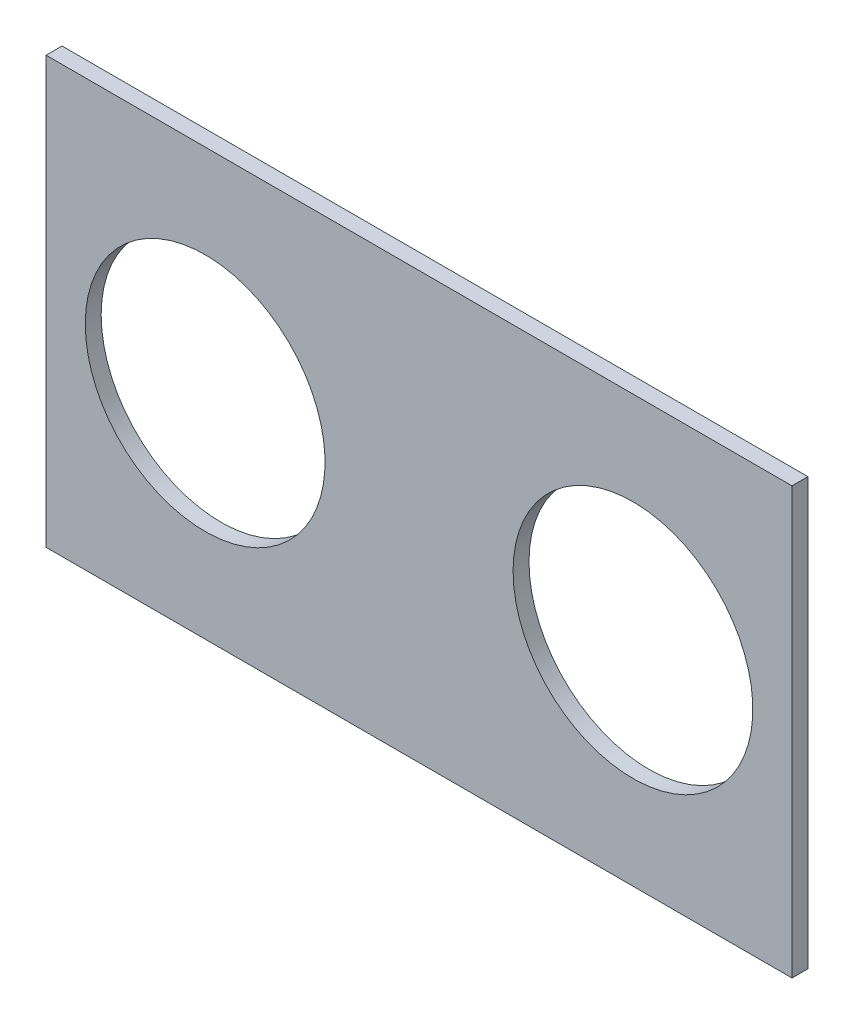
ISO-10303-21;
HEADER;
FILE_DESCRIPTION(('STEP AP214'),'2;1');
FILE_NAME('part.step','',(''),(''),'','','');
FILE_SCHEMA(('AUTOMOTIVE_DESIGN { 1 0 10303 214 1 1 1 1 }'));
ENDSEC;
DATA;
#1=APPLICATION_CONTEXT('core data for automotive mechanical design processes');
#2=APPLICATION_PROTOCOL_DEFINITION('international standard','automotive_design',2000,#1);
#3=PRODUCT_CONTEXT('',#1,'mechanical');
#4=PRODUCT('Part','Part','',(#3));
#5=PRODUCT_RELATED_PRODUCT_CATEGORY('part','',(#4));
#6=PRODUCT_DEFINITION_FORMATION('','',#4);
#7=PRODUCT_DEFINITION_CONTEXT('part definition',#1,'design');
#8=PRODUCT_DEFINITION('design','',#6,#7);
#9=PRODUCT_DEFINITION_SHAPE('','',#8);
#10=(LENGTH_UNIT() NAMED_UNIT(*) SI_UNIT(.MILLI.,.METRE.));
#11=(NAMED_UNIT(*) PLANE_ANGLE_UNIT() SI_UNIT($,.RADIAN.));
#12=(NAMED_UNIT(*) SI_UNIT($,.STERADIAN.) SOLID_ANGLE_UNIT());
#13=UNCERTAINTY_MEASURE_WITH_UNIT(LENGTH_MEASURE(1.E-05),#10,'distance_accuracy_value','');
#14=(GEOMETRIC_REPRESENTATION_CONTEXT(3) GLOBAL_UNCERTAINTY_ASSIGNED_CONTEXT((#13)) GLOBAL_UNIT_ASSIGNED_CONTEXT((#10,
#11,#12)) REPRESENTATION_CONTEXT('',''));
#15=CARTESIAN_POINT('',(0.,0.,0.));
#16=DIRECTION('',(0.,0.,1.));
#17=DIRECTION('',(1.,0.,0.));
#18=AXIS2_PLACEMENT_3D('',#15,#16,#17);
#19=CARTESIAN_POINT('',(0.,0.,1.89738));
#20=DIRECTION('',(0.,0.,1.));
#21=DIRECTION('',(1.,0.,0.));
#22=AXIS2_PLACEMENT_3D('',#19,#20,#21);
#23=PLANE('',#22);
#24=CARTESIAN_POINT('',(0.,0.,1.89738));
#25=DIRECTION('',(0.,0.,1.));
#26=DIRECTION('',(1.,0.,0.));
#27=AXIS2_PLACEMENT_3D('',#24,#25,#26);
#28=CIRCLE('',#27,14.2875);
#29=CARTESIAN_POINT('',(-14.2875,0.,1.89738));
#30=VERTEX_POINT('',#29);
#31=EDGE_CURVE('E110',#30,#30,#28,.T.);
#32=ORIENTED_EDGE('',*,*,#31,.F.);
#33=EDGE_LOOP('',(#32));
#34=FACE_BOUND('',#33,.T.);
#35=DIRECTION('',(0.,-1.,0.));
#36=VECTOR('',#35,1.);
#37=CARTESIAN_POINT('',(-18.95475,25.4,1.89738));
#38=LINE('',#37,#36);
#39=CARTESIAN_POINT('',(-18.95475,25.4,1.89738));
#40=VERTEX_POINT('',#39);
#41=CARTESIAN_POINT('',(-18.95475,-25.4,1.89738));
#42=VERTEX_POINT('',#41);
#43=EDGE_CURVE('E95',#40,#42,#38,.T.);
#44=ORIENTED_EDGE('',*,*,#43,.T.);
#45=DIRECTION('',(1.,0.,0.));
#46=VECTOR('',#45,1.);
#47=CARTESIAN_POINT('',(-18.95475,-25.4,1.89738));
#48=LINE('',#47,#46);
#49=CARTESIAN_POINT('',(69.94525,-25.4,1.89738));
#50=VERTEX_POINT('',#49);
#51=EDGE_CURVE('E90',#42,#50,#48,.T.);
#52=ORIENTED_EDGE('',*,*,#51,.T.);
#53=DIRECTION('',(0.,1.,0.));
#54=VECTOR('',#53,1.);
#55=CARTESIAN_POINT('',(69.94525,25.4,1.89738));
#56=LINE('',#55,#54);
#57=CARTESIAN_POINT('',(69.94525,25.4,1.89738));
#58=VERTEX_POINT('',#57);
#59=EDGE_CURVE('E93',#50,#58,#56,.T.);
#60=ORIENTED_EDGE('',*,*,#59,.T.);
#61=DIRECTION('',(-1.,0.,0.));
#62=VECTOR('',#61,1.);
#63=CARTESIAN_POINT('',(-18.95475,25.4,1.89738));
#64=LINE('',#63,#62);
#65=EDGE_CURVE('E60',#58,#40,#64,.T.);
#66=ORIENTED_EDGE('',*,*,#65,.T.);
#67=EDGE_LOOP('',(#44,#52,#60,#66));
#68=FACE_BOUND('',#67,.T.);
#69=CARTESIAN_POINT('',(50.9905,0.,1.89738));
#70=DIRECTION('',(0.,0.,1.));
#71=DIRECTION('',(1.,0.,0.));
#72=AXIS2_PLACEMENT_3D('',#69,#70,#71);
#73=CIRCLE('',#72,14.2875);
#74=CARTESIAN_POINT('',(36.703,0.,1.89738));
#75=VERTEX_POINT('',#74);
#76=EDGE_CURVE('E125',#75,#75,#73,.T.);
#77=ORIENTED_EDGE('',*,*,#76,.F.);
#78=EDGE_LOOP('',(#77));
#79=FACE_BOUND('',#78,.T.);
#80=ADVANCED_FACE('F43',(#34,#68,#79),#23,.T.);
#81=CARTESIAN_POINT('',(0.,0.,0.));
#82=DIRECTION('',(0.,0.,1.));
#83=DIRECTION('',(1.,0.,0.));
#84=AXIS2_PLACEMENT_3D('',#81,#82,#83);
#85=PLANE('',#84);
#86=DIRECTION('',(0.,-1.,0.));
#87=VECTOR('',#86,1.);
#88=CARTESIAN_POINT('',(-18.95475,25.4,0.));
#89=LINE('',#88,#87);
#90=CARTESIAN_POINT('',(-18.95475,25.4,0.));
#91=VERTEX_POINT('',#90);
#92=CARTESIAN_POINT('',(-18.95475,-25.4,0.));
#93=VERTEX_POINT('',#92);
#94=EDGE_CURVE('E107',#91,#93,#89,.T.);
#95=ORIENTED_EDGE('',*,*,#94,.F.);
#96=DIRECTION('',(-1.,0.,0.));
#97=VECTOR('',#96,1.);
#98=CARTESIAN_POINT('',(-18.95475,25.4,0.));
#99=LINE('',#98,#97);
#100=CARTESIAN_POINT('',(69.94525,25.4,0.));
#101=VERTEX_POINT('',#100);
#102=EDGE_CURVE('E83',#101,#91,#99,.T.);
#103=ORIENTED_EDGE('',*,*,#102,.F.);
#104=DIRECTION('',(0.,1.,0.));
#105=VECTOR('',#104,1.);
#106=CARTESIAN_POINT('',(69.94525,25.4,0.));
#107=LINE('',#106,#105);
#108=CARTESIAN_POINT('',(69.94525,-25.4,0.));
#109=VERTEX_POINT('',#108);
#110=EDGE_CURVE('E77',#109,#101,#107,.T.);
#111=ORIENTED_EDGE('',*,*,#110,.F.);
#112=DIRECTION('',(1.,0.,0.));
#113=VECTOR('',#112,1.);
#114=CARTESIAN_POINT('',(-18.95475,-25.4,0.));
#115=LINE('',#114,#113);
#116=EDGE_CURVE('E99',#93,#109,#115,.T.);
#117=ORIENTED_EDGE('',*,*,#116,.F.);
#118=EDGE_LOOP('',(#95,#103,#111,#117));
#119=FACE_BOUND('',#118,.T.);
#120=CARTESIAN_POINT('',(0.,0.,0.));
#121=DIRECTION('',(0.,0.,1.));
#122=DIRECTION('',(1.,0.,0.));
#123=AXIS2_PLACEMENT_3D('',#120,#121,#122);
#124=CIRCLE('',#123,14.2875);
#125=CARTESIAN_POINT('',(-14.2875,0.,0.));
#126=VERTEX_POINT('',#125);
#127=EDGE_CURVE('E122',#126,#126,#124,.T.);
#128=ORIENTED_EDGE('',*,*,#127,.T.);
#129=EDGE_LOOP('',(#128));
#130=FACE_BOUND('',#129,.T.);
#131=CARTESIAN_POINT('',(50.9905,0.,0.));
#132=DIRECTION('',(0.,0.,1.));
#133=DIRECTION('',(1.,0.,0.));
#134=AXIS2_PLACEMENT_3D('',#131,#132,#133);
#135=CIRCLE('',#134,14.2875);
#136=CARTESIAN_POINT('',(36.703,0.,0.));
#137=VERTEX_POINT('',#136);
#138=EDGE_CURVE('E128',#137,#137,#135,.T.);
#139=ORIENTED_EDGE('',*,*,#138,.T.);
#140=EDGE_LOOP('',(#139));
#141=FACE_BOUND('',#140,.T.);
#142=ADVANCED_FACE('F118',(#119,#130,#141),#85,.F.);
#143=CARTESIAN_POINT('',(-18.95475,25.4,1.89738));
#144=DIRECTION('',(1.,0.,0.));
#145=DIRECTION('',(0.,1.,0.));
#146=AXIS2_PLACEMENT_3D('',#143,#144,#145);
#147=PLANE('',#146);
#148=ORIENTED_EDGE('',*,*,#94,.T.);
#149=DIRECTION('',(0.,0.,-1.));
#150=VECTOR('',#149,1.);
#151=CARTESIAN_POINT('',(-18.95475,-25.4,1.89738));
#152=LINE('',#151,#150);
#153=EDGE_CURVE('E11',#42,#93,#152,.T.);
#154=ORIENTED_EDGE('',*,*,#153,.F.);
#155=ORIENTED_EDGE('',*,*,#43,.F.);
#156=DIRECTION('',(0.,0.,-1.));
#157=VECTOR('',#156,1.);
#158=CARTESIAN_POINT('',(-18.95475,25.4,1.89738));
#159=LINE('',#158,#157);
#160=EDGE_CURVE('E103',#40,#91,#159,.T.);
#161=ORIENTED_EDGE('',*,*,#160,.T.);
#162=EDGE_LOOP('',(#148,#154,#155,#161));
#163=FACE_BOUND('',#162,.T.);
#164=ADVANCED_FACE('F45',(#163),#147,.F.);
#165=CARTESIAN_POINT('',(-18.95475,-25.4,1.89738));
#166=DIRECTION('',(0.,1.,0.));
#167=DIRECTION('',(-1.,0.,0.));
#168=AXIS2_PLACEMENT_3D('',#165,#166,#167);
#169=PLANE('',#168);
#170=ORIENTED_EDGE('',*,*,#116,.T.);
#171=DIRECTION('',(0.,0.,-1.));
#172=VECTOR('',#171,1.);
#173=CARTESIAN_POINT('',(69.94525,-25.4,1.89738));
#174=LINE('',#173,#172);
#175=EDGE_CURVE('E52',#50,#109,#174,.T.);
#176=ORIENTED_EDGE('',*,*,#175,.F.);
#177=ORIENTED_EDGE('',*,*,#51,.F.);
#178=ORIENTED_EDGE('',*,*,#153,.T.);
#179=EDGE_LOOP('',(#170,#176,#177,#178));
#180=FACE_BOUND('',#179,.T.);
#181=ADVANCED_FACE('F98',(#180),#169,.F.);
#182=CARTESIAN_POINT('',(69.94525,25.4,1.89738));
#183=DIRECTION('',(-1.,0.,0.));
#184=DIRECTION('',(0.,0.,1.));
#185=AXIS2_PLACEMENT_3D('',#182,#183,#184);
#186=PLANE('',#185);
#187=ORIENTED_EDGE('',*,*,#110,.T.);
#188=DIRECTION('',(0.,0.,-1.));
#189=VECTOR('',#188,1.);
#190=CARTESIAN_POINT('',(69.94525,25.4,1.89738));
#191=LINE('',#190,#189);
#192=EDGE_CURVE('E100',#58,#101,#191,.T.);
#193=ORIENTED_EDGE('',*,*,#192,.F.);
#194=ORIENTED_EDGE('',*,*,#59,.F.);
#195=ORIENTED_EDGE('',*,*,#175,.T.);
#196=EDGE_LOOP('',(#187,#193,#194,#195));
#197=FACE_BOUND('',#196,.T.);
#198=ADVANCED_FACE('F101',(#197),#186,.F.);
#199=CARTESIAN_POINT('',(-18.95475,25.4,1.89738));
#200=DIRECTION('',(0.,-1.,0.));
#201=DIRECTION('',(1.,0.,0.));
#202=AXIS2_PLACEMENT_3D('',#199,#200,#201);
#203=PLANE('',#202);
#204=ORIENTED_EDGE('',*,*,#102,.T.);
#205=ORIENTED_EDGE('',*,*,#160,.F.);
#206=ORIENTED_EDGE('',*,*,#65,.F.);
#207=ORIENTED_EDGE('',*,*,#192,.T.);
#208=EDGE_LOOP('',(#204,#205,#206,#207));
#209=FACE_BOUND('',#208,.T.);
#210=ADVANCED_FACE('F115',(#209),#203,.F.);
#211=CARTESIAN_POINT('',(0.,0.,1.89738));
#212=DIRECTION('',(0.,0.,-1.));
#213=DIRECTION('',(-1.,0.,0.));
#214=AXIS2_PLACEMENT_3D('',#211,#212,#213);
#215=CYLINDRICAL_SURFACE('',#214,14.2875);
#216=CARTESIAN_POINT('',(-14.2875,0.,1.89738));
#217=CARTESIAN_POINT('',(-14.2875,0.,1.877615625));
#218=CARTESIAN_POINT('',(-14.2875,0.,1.85785125));
#219=CARTESIAN_POINT('',(-14.2875,0.,1.8183225));
#220=CARTESIAN_POINT('',(-14.2875,0.,1.798558125));
#221=CARTESIAN_POINT('',(-14.2875,0.,1.759029375));
#222=CARTESIAN_POINT('',(-14.2875,0.,1.739265));
#223=CARTESIAN_POINT('',(-14.2875,0.,1.69973625));
#224=CARTESIAN_POINT('',(-14.2875,0.,1.679971875));
#225=CARTESIAN_POINT('',(-14.2875,0.,1.640443125));
#226=CARTESIAN_POINT('',(-14.2875,0.,1.62067875));
#227=CARTESIAN_POINT('',(-14.2875,0.,1.58115));
#228=CARTESIAN_POINT('',(-14.2875,0.,1.561385625));
#229=CARTESIAN_POINT('',(-14.2875,0.,1.521856875));
#230=CARTESIAN_POINT('',(-14.2875,0.,1.5020925));
#231=CARTESIAN_POINT('',(-14.2875,0.,1.46256375));
#232=CARTESIAN_POINT('',(-14.2875,0.,1.442799375));
#233=CARTESIAN_POINT('',(-14.2875,0.,1.403270625));
#234=CARTESIAN_POINT('',(-14.2875,0.,1.38350625));
#235=CARTESIAN_POINT('',(-14.2875,0.,1.3439775));
#236=CARTESIAN_POINT('',(-14.2875,0.,1.324213125));
#237=CARTESIAN_POINT('',(-14.2875,0.,1.284684375));
#238=CARTESIAN_POINT('',(-14.2875,0.,1.26492));
#239=CARTESIAN_POINT('',(-14.2875,0.,1.22539125));
#240=CARTESIAN_POINT('',(-14.2875,0.,1.205626875));
#241=CARTESIAN_POINT('',(-14.2875,0.,1.166098125));
#242=CARTESIAN_POINT('',(-14.2875,0.,1.14633375));
#243=CARTESIAN_POINT('',(-14.2875,0.,1.106805));
#244=CARTESIAN_POINT('',(-14.2875,0.,1.087040625));
#245=CARTESIAN_POINT('',(-14.2875,0.,1.047511875));
#246=CARTESIAN_POINT('',(-14.2875,0.,1.0277475));
#247=CARTESIAN_POINT('',(-14.2875,0.,0.98821875));
#248=CARTESIAN_POINT('',(-14.2875,0.,0.968454375));
#249=CARTESIAN_POINT('',(-14.2875,0.,0.928925625));
#250=CARTESIAN_POINT('',(-14.2875,0.,0.90916125));
#251=CARTESIAN_POINT('',(-14.2875,0.,0.8696325));
#252=CARTESIAN_POINT('',(-14.2875,0.,0.849868125));
#253=CARTESIAN_POINT('',(-14.2875,0.,0.810339375));
#254=CARTESIAN_POINT('',(-14.2875,0.,0.790575));
#255=CARTESIAN_POINT('',(-14.2875,0.,0.75104625));
#256=CARTESIAN_POINT('',(-14.2875,0.,0.731281875));
#257=CARTESIAN_POINT('',(-14.2875,0.,0.691753125));
#258=CARTESIAN_POINT('',(-14.2875,0.,0.67198875));
#259=CARTESIAN_POINT('',(-14.2875,0.,0.63246));
#260=CARTESIAN_POINT('',(-14.2875,0.,0.612695625));
#261=CARTESIAN_POINT('',(-14.2875,0.,0.573166875));
#262=CARTESIAN_POINT('',(-14.2875,0.,0.5534025));
#263=CARTESIAN_POINT('',(-14.2875,0.,0.51387375));
#264=CARTESIAN_POINT('',(-14.2875,0.,0.494109375));
#265=CARTESIAN_POINT('',(-14.2875,0.,0.454580625));
#266=CARTESIAN_POINT('',(-14.2875,0.,0.43481625));
#267=CARTESIAN_POINT('',(-14.2875,0.,0.3952875));
#268=CARTESIAN_POINT('',(-14.2875,0.,0.375523125));
#269=CARTESIAN_POINT('',(-14.2875,0.,0.335994375));
#270=CARTESIAN_POINT('',(-14.2875,0.,0.31623));
#271=CARTESIAN_POINT('',(-14.2875,0.,0.27670125));
#272=CARTESIAN_POINT('',(-14.2875,0.,0.256936875));
#273=CARTESIAN_POINT('',(-14.2875,0.,0.217408125));
#274=CARTESIAN_POINT('',(-14.2875,0.,0.19764375));
#275=CARTESIAN_POINT('',(-14.2875,0.,0.158115));
#276=CARTESIAN_POINT('',(-14.2875,0.,0.138350625));
#277=CARTESIAN_POINT('',(-14.2875,0.,0.098821875));
#278=CARTESIAN_POINT('',(-14.2875,0.,0.0790574999999999));
#279=CARTESIAN_POINT('',(-14.2875,0.,0.0395287499999999));
#280=CARTESIAN_POINT('',(-14.2875,0.,0.019764375));
#281=CARTESIAN_POINT('',(-14.2875,0.,0.));
#282=B_SPLINE_CURVE_WITH_KNOTS('',3,(#216,#217,#218,#219,#220,#221,#222,#223,#224,#225,#226,
#227,#228,#229,#230,#231,#232,#233,#234,#235,#236,#237,#238,#239,#240,#241,#242,#243,#244,#245,
#246,#247,#248,#249,#250,#251,#252,#253,#254,#255,#256,#257,#258,#259,#260,#261,#262,#263,#264,
#265,#266,#267,#268,#269,#270,#271,#272,#273,#274,#275,#276,#277,#278,#279,#280,#281),
.UNSPECIFIED.,.F.,.F.,(4,2,2,2,2,2,2,2,2,2,2,2,2,2,2,2,2,2,2,2,2,2,2,2,2,2,2,2,2,2,2,2,4),(0.,
0.0592931249999999,0.11858625,0.177879375,0.2371725,0.296465625,0.35575875,0.415051875,0.474345,
0.533638125,0.59293125,0.652224375,0.7115175,0.770810625,0.83010375,0.889396875,0.94869,
1.007983125,1.06727625,1.126569375,1.1858625,1.245155625,1.30444875,1.363741875,1.423035,
1.482328125,1.54162125,1.600914375,1.6602075,1.719500625,1.77879375,1.838086875,1.89738),.UNSPECIFIED.);
#283=EDGE_CURVE('BSEAM145',#30,#126,#282,.T.);
#284=ORIENTED_EDGE('',*,*,#31,.T.);
#285=ORIENTED_EDGE('',*,*,#127,.F.);
#286=ORIENTED_EDGE('',*,*,#283,.T.);
#287=ORIENTED_EDGE('',*,*,#283,.F.);
#288=EDGE_LOOP('',(#284,#286,#285,#287));
#289=FACE_BOUND('',#288,.T.);
#290=ADVANCED_FACE('F145',(#289),#215,.F.);
#291=CARTESIAN_POINT('',(50.9905,0.,1.89738));
#292=DIRECTION('',(0.,0.,-1.));
#293=DIRECTION('',(-1.,0.,0.));
#294=AXIS2_PLACEMENT_3D('',#291,#292,#293);
#295=CYLINDRICAL_SURFACE('',#294,14.2875);
#296=CARTESIAN_POINT('',(36.703,0.,1.89738));
#297=CARTESIAN_POINT('',(36.703,0.,1.877615625));
#298=CARTESIAN_POINT('',(36.703,0.,1.85785125));
#299=CARTESIAN_POINT('',(36.703,0.,1.8183225));
#300=CARTESIAN_POINT('',(36.703,0.,1.798558125));
#301=CARTESIAN_POINT('',(36.703,0.,1.759029375));
#302=CARTESIAN_POINT('',(36.703,0.,1.739265));
#303=CARTESIAN_POINT('',(36.703,0.,1.69973625));
#304=CARTESIAN_POINT('',(36.703,0.,1.679971875));
#305=CARTESIAN_POINT('',(36.703,0.,1.640443125));
#306=CARTESIAN_POINT('',(36.703,0.,1.62067875));
#307=CARTESIAN_POINT('',(36.703,0.,1.58115));
#308=CARTESIAN_POINT('',(36.703,0.,1.561385625));
#309=CARTESIAN_POINT('',(36.703,0.,1.521856875));
#310=CARTESIAN_POINT('',(36.703,0.,1.5020925));
#311=CARTESIAN_POINT('',(36.703,0.,1.46256375));
#312=CARTESIAN_POINT('',(36.703,0.,1.442799375));
#313=CARTESIAN_POINT('',(36.703,0.,1.403270625));
#314=CARTESIAN_POINT('',(36.703,0.,1.38350625));
#315=CARTESIAN_POINT('',(36.703,0.,1.3439775));
#316=CARTESIAN_POINT('',(36.703,0.,1.324213125));
#317=CARTESIAN_POINT('',(36.703,0.,1.284684375));
#318=CARTESIAN_POINT('',(36.703,0.,1.26492));
#319=CARTESIAN_POINT('',(36.703,0.,1.22539125));
#320=CARTESIAN_POINT('',(36.703,0.,1.205626875));
#321=CARTESIAN_POINT('',(36.703,0.,1.166098125));
#322=CARTESIAN_POINT('',(36.703,0.,1.14633375));
#323=CARTESIAN_POINT('',(36.703,0.,1.106805));
#324=CARTESIAN_POINT('',(36.703,0.,1.087040625));
#325=CARTESIAN_POINT('',(36.703,0.,1.047511875));
#326=CARTESIAN_POINT('',(36.703,0.,1.0277475));
#327=CARTESIAN_POINT('',(36.703,0.,0.98821875));
#328=CARTESIAN_POINT('',(36.703,0.,0.968454375));
#329=CARTESIAN_POINT('',(36.703,0.,0.928925625));
#330=CARTESIAN_POINT('',(36.703,0.,0.90916125));
#331=CARTESIAN_POINT('',(36.703,0.,0.8696325));
#332=CARTESIAN_POINT('',(36.703,0.,0.849868125));
#333=CARTESIAN_POINT('',(36.703,0.,0.810339375));
#334=CARTESIAN_POINT('',(36.703,0.,0.790575));
#335=CARTESIAN_POINT('',(36.703,0.,0.75104625));
#336=CARTESIAN_POINT('',(36.703,0.,0.731281875));
#337=CARTESIAN_POINT('',(36.703,0.,0.691753125));
#338=CARTESIAN_POINT('',(36.703,0.,0.67198875));
#339=CARTESIAN_POINT('',(36.703,0.,0.63246));
#340=CARTESIAN_POINT('',(36.703,0.,0.612695625));
#341=CARTESIAN_POINT('',(36.703,0.,0.573166875));
#342=CARTESIAN_POINT('',(36.703,0.,0.5534025));
#343=CARTESIAN_POINT('',(36.703,0.,0.51387375));
#344=CARTESIAN_POINT('',(36.703,0.,0.494109375));
#345=CARTESIAN_POINT('',(36.703,0.,0.454580625));
#346=CARTESIAN_POINT('',(36.703,0.,0.43481625));
#347=CARTESIAN_POINT('',(36.703,0.,0.3952875));
#348=CARTESIAN_POINT('',(36.703,0.,0.375523125));
#349=CARTESIAN_POINT('',(36.703,0.,0.335994375));
#350=CARTESIAN_POINT('',(36.703,0.,0.31623));
#351=CARTESIAN_POINT('',(36.703,0.,0.27670125));
#352=CARTESIAN_POINT('',(36.703,0.,0.256936875));
#353=CARTESIAN_POINT('',(36.703,0.,0.217408125));
#354=CARTESIAN_POINT('',(36.703,0.,0.19764375));
#355=CARTESIAN_POINT('',(36.703,0.,0.158115));
#356=CARTESIAN_POINT('',(36.703,0.,0.138350625));
#357=CARTESIAN_POINT('',(36.703,0.,0.098821875));
#358=CARTESIAN_POINT('',(36.703,0.,0.0790574999999999));
#359=CARTESIAN_POINT('',(36.703,0.,0.0395287499999999));
#360=CARTESIAN_POINT('',(36.703,0.,0.019764375));
#361=CARTESIAN_POINT('',(36.703,0.,0.));
#362=B_SPLINE_CURVE_WITH_KNOTS('',3,(#296,#297,#298,#299,#300,#301,#302,#303,#304,#305,#306,
#307,#308,#309,#310,#311,#312,#313,#314,#315,#316,#317,#318,#319,#320,#321,#322,#323,#324,#325,
#326,#327,#328,#329,#330,#331,#332,#333,#334,#335,#336,#337,#338,#339,#340,#341,#342,#343,#344,
#345,#346,#347,#348,#349,#350,#351,#352,#353,#354,#355,#356,#357,#358,#359,#360,#361),
.UNSPECIFIED.,.F.,.F.,(4,2,2,2,2,2,2,2,2,2,2,2,2,2,2,2,2,2,2,2,2,2,2,2,2,2,2,2,2,2,2,2,4),(0.,
0.0592931249999999,0.11858625,0.177879375,0.2371725,0.296465625,0.35575875,0.415051875,0.474345,
0.533638125,0.59293125,0.652224375,0.7115175,0.770810625,0.83010375,0.889396875,0.94869,
1.007983125,1.06727625,1.126569375,1.1858625,1.245155625,1.30444875,1.363741875,1.423035,
1.482328125,1.54162125,1.600914375,1.6602075,1.719500625,1.77879375,1.838086875,1.89738),.UNSPECIFIED.);
#363=EDGE_CURVE('BSEAM134',#75,#137,#362,.T.);
#364=ORIENTED_EDGE('',*,*,#76,.T.);
#365=ORIENTED_EDGE('',*,*,#138,.F.);
#366=ORIENTED_EDGE('',*,*,#363,.T.);
#367=ORIENTED_EDGE('',*,*,#363,.F.);
#368=EDGE_LOOP('',(#364,#366,#365,#367));
#369=FACE_BOUND('',#368,.T.);
#370=ADVANCED_FACE('F134',(#369),#295,.F.);
#371=CLOSED_SHELL('',(#80,#142,#164,#181,#198,#210,#290,#370));
#372=MANIFOLD_SOLID_BREP('B2',#371);
#373=ADVANCED_BREP_SHAPE_REPRESENTATION('',(#18,#372),#14);
#374=SHAPE_DEFINITION_REPRESENTATION(#9,#373);
ENDSEC;
END-ISO-10303-21;
